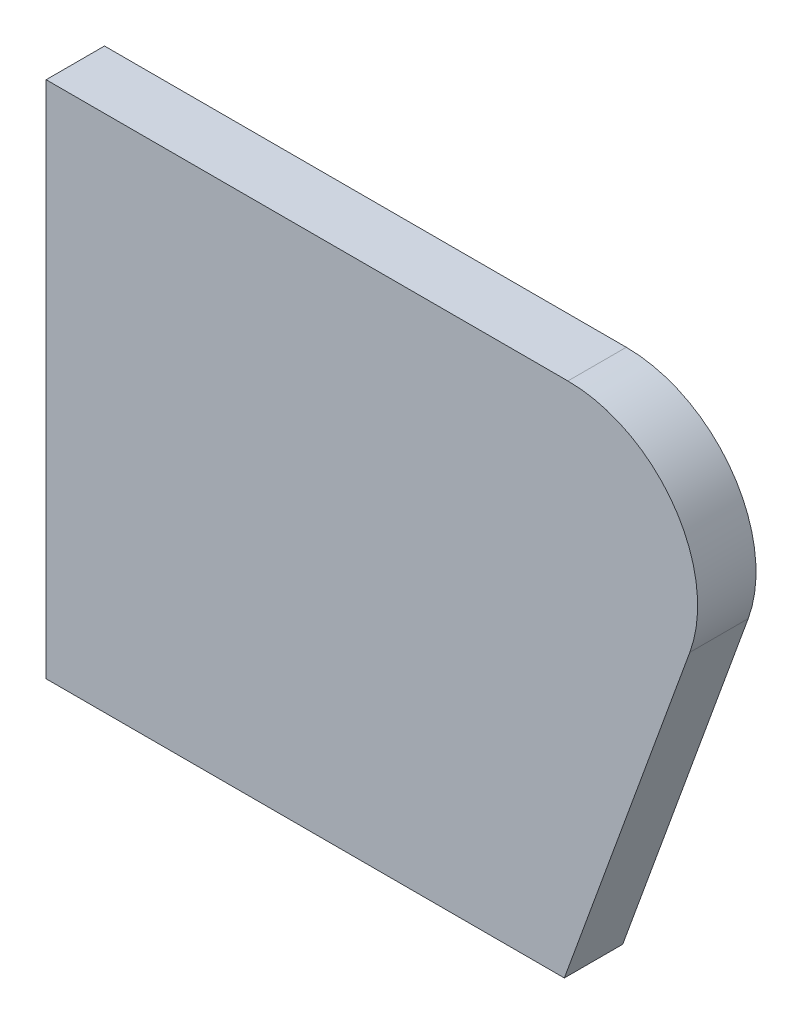
ISO-10303-21;
HEADER;
FILE_DESCRIPTION(('STEP AP214'),'2;1');
FILE_NAME('part.step','',(''),(''),'','','');
FILE_SCHEMA(('AUTOMOTIVE_DESIGN { 1 0 10303 214 1 1 1 1 }'));
ENDSEC;
DATA;
#1=APPLICATION_CONTEXT('core data for automotive mechanical design processes');
#2=APPLICATION_PROTOCOL_DEFINITION('international standard','automotive_design',2000,#1);
#3=PRODUCT_CONTEXT('',#1,'mechanical');
#4=PRODUCT('Part','Part','',(#3));
#5=PRODUCT_RELATED_PRODUCT_CATEGORY('part','',(#4));
#6=PRODUCT_DEFINITION_FORMATION('','',#4);
#7=PRODUCT_DEFINITION_CONTEXT('part definition',#1,'design');
#8=PRODUCT_DEFINITION('design','',#6,#7);
#9=PRODUCT_DEFINITION_SHAPE('','',#8);
#10=(LENGTH_UNIT() NAMED_UNIT(*) SI_UNIT(.MILLI.,.METRE.));
#11=(NAMED_UNIT(*) PLANE_ANGLE_UNIT() SI_UNIT($,.RADIAN.));
#12=(NAMED_UNIT(*) SI_UNIT($,.STERADIAN.) SOLID_ANGLE_UNIT());
#13=UNCERTAINTY_MEASURE_WITH_UNIT(LENGTH_MEASURE(1.E-05),#10,'distance_accuracy_value','');
#14=(GEOMETRIC_REPRESENTATION_CONTEXT(3) GLOBAL_UNCERTAINTY_ASSIGNED_CONTEXT((#13)) GLOBAL_UNIT_ASSIGNED_CONTEXT((#10,
#11,#12)) REPRESENTATION_CONTEXT('',''));
#15=CARTESIAN_POINT('',(0.,0.,0.));
#16=DIRECTION('',(0.,0.,1.));
#17=DIRECTION('',(1.,0.,0.));
#18=AXIS2_PLACEMENT_3D('',#15,#16,#17);
#19=CARTESIAN_POINT('',(-585.929666666667,1301.23951642609,-180.));
#20=DIRECTION('',(0.,-1.,0.));
#21=DIRECTION('',(0.,0.,1.));
#22=AXIS2_PLACEMENT_3D('',#19,#20,#21);
#23=PLANE('',#22);
#24=DIRECTION('',(-1.,0.,0.));
#25=VECTOR('',#24,1.);
#26=CARTESIAN_POINT('',(-585.929666666667,1301.23951642609,0.));
#27=LINE('',#26,#25);
#28=CARTESIAN_POINT('',(1023.14280044333,1301.23951642609,0.));
#29=VERTEX_POINT('',#28);
#30=CARTESIAN_POINT('',(-585.929666666667,1301.23951642609,0.));
#31=VERTEX_POINT('',#30);
#32=EDGE_CURVE('E114',#29,#31,#27,.T.);
#33=ORIENTED_EDGE('',*,*,#32,.F.);
#34=DIRECTION('',(0.,0.,1.));
#35=VECTOR('',#34,1.);
#36=CARTESIAN_POINT('',(1023.14280044333,1301.23951642609,-180.));
#37=LINE('',#36,#35);
#38=CARTESIAN_POINT('',(1023.14280044333,1301.23951642609,-180.));
#39=VERTEX_POINT('',#38);
#40=EDGE_CURVE('E113',#39,#29,#37,.T.);
#41=ORIENTED_EDGE('',*,*,#40,.F.);
#42=DIRECTION('',(-1.,0.,0.));
#43=VECTOR('',#42,1.);
#44=CARTESIAN_POINT('',(-585.929666666667,1301.23951642609,-180.));
#45=LINE('',#44,#43);
#46=CARTESIAN_POINT('',(-585.929666666667,1301.23951642609,-180.));
#47=VERTEX_POINT('',#46);
#48=EDGE_CURVE('E108',#39,#47,#45,.T.);
#49=ORIENTED_EDGE('',*,*,#48,.T.);
#50=DIRECTION('',(0.,0.,1.));
#51=VECTOR('',#50,1.);
#52=CARTESIAN_POINT('',(-585.929666666667,1301.23951642609,-180.));
#53=LINE('',#52,#51);
#54=EDGE_CURVE('E11',#47,#31,#53,.T.);
#55=ORIENTED_EDGE('',*,*,#54,.T.);
#56=EDGE_LOOP('',(#33,#41,#49,#55));
#57=FACE_BOUND('',#56,.T.);
#58=ADVANCED_FACE('F39',(#57),#23,.F.);
#59=CARTESIAN_POINT('',(-585.929666666667,1301.23951642609,-180.));
#60=DIRECTION('',(1.,0.,0.));
#61=DIRECTION('',(0.,1.,0.));
#62=AXIS2_PLACEMENT_3D('',#59,#60,#61);
#63=PLANE('',#62);
#64=DIRECTION('',(0.,-1.,0.));
#65=VECTOR('',#64,1.);
#66=CARTESIAN_POINT('',(-585.929666666667,1301.23951642609,0.));
#67=LINE('',#66,#65);
#68=CARTESIAN_POINT('',(-585.929666666667,-298.754652173913,0.));
#69=VERTEX_POINT('',#68);
#70=EDGE_CURVE('E116',#31,#69,#67,.T.);
#71=ORIENTED_EDGE('',*,*,#70,.F.);
#72=ORIENTED_EDGE('',*,*,#54,.F.);
#73=DIRECTION('',(0.,-1.,0.));
#74=VECTOR('',#73,1.);
#75=CARTESIAN_POINT('',(-585.929666666667,1301.23951642609,-180.));
#76=LINE('',#75,#74);
#77=CARTESIAN_POINT('',(-585.929666666667,-298.754652173913,-180.));
#78=VERTEX_POINT('',#77);
#79=EDGE_CURVE('E84',#47,#78,#76,.T.);
#80=ORIENTED_EDGE('',*,*,#79,.T.);
#81=DIRECTION('',(0.,0.,1.));
#82=VECTOR('',#81,1.);
#83=CARTESIAN_POINT('',(-585.929666666667,-298.754652173913,-180.));
#84=LINE('',#83,#82);
#85=EDGE_CURVE('E47',#78,#69,#84,.T.);
#86=ORIENTED_EDGE('',*,*,#85,.T.);
#87=EDGE_LOOP('',(#71,#72,#80,#86));
#88=FACE_BOUND('',#87,.T.);
#89=ADVANCED_FACE('F125',(#88),#63,.F.);
#90=CARTESIAN_POINT('',(-585.929666666667,-298.754652173913,-180.));
#91=DIRECTION('',(0.,1.,0.));
#92=DIRECTION('',(0.,0.,-1.));
#93=AXIS2_PLACEMENT_3D('',#90,#91,#92);
#94=PLANE('',#93);
#95=DIRECTION('',(1.,0.,0.));
#96=VECTOR('',#95,1.);
#97=CARTESIAN_POINT('',(-585.929666666667,-298.754652173913,0.));
#98=LINE('',#97,#96);
#99=CARTESIAN_POINT('',(1012.06033333333,-298.754652173913,0.));
#100=VERTEX_POINT('',#99);
#101=EDGE_CURVE('E119',#69,#100,#98,.T.);
#102=ORIENTED_EDGE('',*,*,#101,.F.);
#103=ORIENTED_EDGE('',*,*,#85,.F.);
#104=DIRECTION('',(1.,0.,0.));
#105=VECTOR('',#104,1.);
#106=CARTESIAN_POINT('',(-585.929666666667,-298.754652173913,-180.));
#107=LINE('',#106,#105);
#108=CARTESIAN_POINT('',(1012.06033333333,-298.754652173913,-180.));
#109=VERTEX_POINT('',#108);
#110=EDGE_CURVE('E93',#78,#109,#107,.T.);
#111=ORIENTED_EDGE('',*,*,#110,.T.);
#112=DIRECTION('',(0.,0.,1.));
#113=VECTOR('',#112,1.);
#114=CARTESIAN_POINT('',(1012.06033333333,-298.754652173913,-180.));
#115=LINE('',#114,#113);
#116=EDGE_CURVE('E98',#109,#100,#115,.T.);
#117=ORIENTED_EDGE('',*,*,#116,.T.);
#118=EDGE_LOOP('',(#102,#103,#111,#117));
#119=FACE_BOUND('',#118,.T.);
#120=ADVANCED_FACE('F105',(#119),#94,.F.);
#121=CARTESIAN_POINT('',(1012.06033333333,-298.754652173913,-180.));
#122=DIRECTION('',(-0.93969262078591,0.342020143325665,0.));
#123=DIRECTION('',(-0.342020143325665,-0.93969262078591,0.));
#124=AXIS2_PLACEMENT_3D('',#121,#122,#123);
#125=PLANE('',#124);
#126=DIRECTION('',(0.342020143325665,0.93969262078591,0.));
#127=VECTOR('',#126,1.);
#128=CARTESIAN_POINT('',(1012.06033333333,-298.754652173913,0.));
#129=LINE('',#128,#127);
#130=CARTESIAN_POINT('',(1399.02840255742,764.431380069221,0.));
#131=VERTEX_POINT('',#130);
#132=EDGE_CURVE('E100',#100,#131,#129,.T.);
#133=ORIENTED_EDGE('',*,*,#132,.F.);
#134=ORIENTED_EDGE('',*,*,#116,.F.);
#135=DIRECTION('',(0.342020143325665,0.93969262078591,0.));
#136=VECTOR('',#135,1.);
#137=CARTESIAN_POINT('',(1012.06033333333,-298.754652173913,-180.));
#138=LINE('',#137,#136);
#139=CARTESIAN_POINT('',(1399.02840255742,764.431380069221,-180.));
#140=VERTEX_POINT('',#139);
#141=EDGE_CURVE('E89',#109,#140,#138,.T.);
#142=ORIENTED_EDGE('',*,*,#141,.T.);
#143=DIRECTION('',(0.,0.,1.));
#144=VECTOR('',#143,1.);
#145=CARTESIAN_POINT('',(1399.02840255742,764.431380069221,-180.));
#146=LINE('',#145,#144);
#147=EDGE_CURVE('E103',#140,#131,#146,.T.);
#148=ORIENTED_EDGE('',*,*,#147,.T.);
#149=EDGE_LOOP('',(#133,#134,#142,#148));
#150=FACE_BOUND('',#149,.T.);
#151=ADVANCED_FACE('F99',(#150),#125,.F.);
#152=CARTESIAN_POINT('',(1023.15138303989,901.239516518154,-180.));
#153=DIRECTION('',(0.,0.,1.));
#154=DIRECTION('',(-1.,0.,0.));
#155=AXIS2_PLACEMENT_3D('',#152,#153,#154);
#156=CYLINDRICAL_SURFACE('',#155,400.000000000009);
#157=CARTESIAN_POINT('',(1023.15138303989,901.239516518154,0.));
#158=DIRECTION('',(0.,0.,1.));
#159=DIRECTION('',(1.,0.,0.));
#160=AXIS2_PLACEMENT_3D('',#157,#158,#159);
#161=CIRCLE('',#160,400.000000000009);
#162=EDGE_CURVE('E72',#131,#29,#161,.T.);
#163=ORIENTED_EDGE('',*,*,#162,.F.);
#164=ORIENTED_EDGE('',*,*,#147,.F.);
#165=CARTESIAN_POINT('',(1023.15138303989,901.239516518154,-180.));
#166=DIRECTION('',(0.,0.,1.));
#167=DIRECTION('',(1.,0.,0.));
#168=AXIS2_PLACEMENT_3D('',#165,#166,#167);
#169=CIRCLE('',#168,400.000000000009);
#170=EDGE_CURVE('E55',#140,#39,#169,.T.);
#171=ORIENTED_EDGE('',*,*,#170,.T.);
#172=ORIENTED_EDGE('',*,*,#40,.T.);
#173=EDGE_LOOP('',(#163,#164,#171,#172));
#174=FACE_BOUND('',#173,.T.);
#175=ADVANCED_FACE('F131',(#174),#156,.T.);
#176=CARTESIAN_POINT('',(1023.15138303989,901.239516518154,-180.));
#177=DIRECTION('',(0.,0.,-1.));
#178=DIRECTION('',(1.,0.,0.));
#179=AXIS2_PLACEMENT_3D('',#176,#177,#178);
#180=PLANE('',#179);
#181=ORIENTED_EDGE('',*,*,#48,.F.);
#182=ORIENTED_EDGE('',*,*,#170,.F.);
#183=ORIENTED_EDGE('',*,*,#141,.F.);
#184=ORIENTED_EDGE('',*,*,#110,.F.);
#185=ORIENTED_EDGE('',*,*,#79,.F.);
#186=EDGE_LOOP('',(#181,#182,#183,#184,#185));
#187=FACE_BOUND('',#186,.T.);
#188=ADVANCED_FACE('F91',(#187),#180,.T.);
#189=CARTESIAN_POINT('',(1023.15138303989,901.239516518154,0.));
#190=DIRECTION('',(0.,0.,-1.));
#191=DIRECTION('',(1.,0.,0.));
#192=AXIS2_PLACEMENT_3D('',#189,#190,#191);
#193=PLANE('',#192);
#194=ORIENTED_EDGE('',*,*,#32,.T.);
#195=ORIENTED_EDGE('',*,*,#70,.T.);
#196=ORIENTED_EDGE('',*,*,#101,.T.);
#197=ORIENTED_EDGE('',*,*,#132,.T.);
#198=ORIENTED_EDGE('',*,*,#162,.T.);
#199=EDGE_LOOP('',(#194,#195,#196,#197,#198));
#200=FACE_BOUND('',#199,.T.);
#201=ADVANCED_FACE('F126',(#200),#193,.F.);
#202=CLOSED_SHELL('',(#58,#89,#120,#151,#175,#188,#201));
#203=MANIFOLD_SOLID_BREP('B2',#202);
#204=ADVANCED_BREP_SHAPE_REPRESENTATION('',(#18,#203),#14);
#205=SHAPE_DEFINITION_REPRESENTATION(#9,#204);
ENDSEC;
END-ISO-10303-21;
